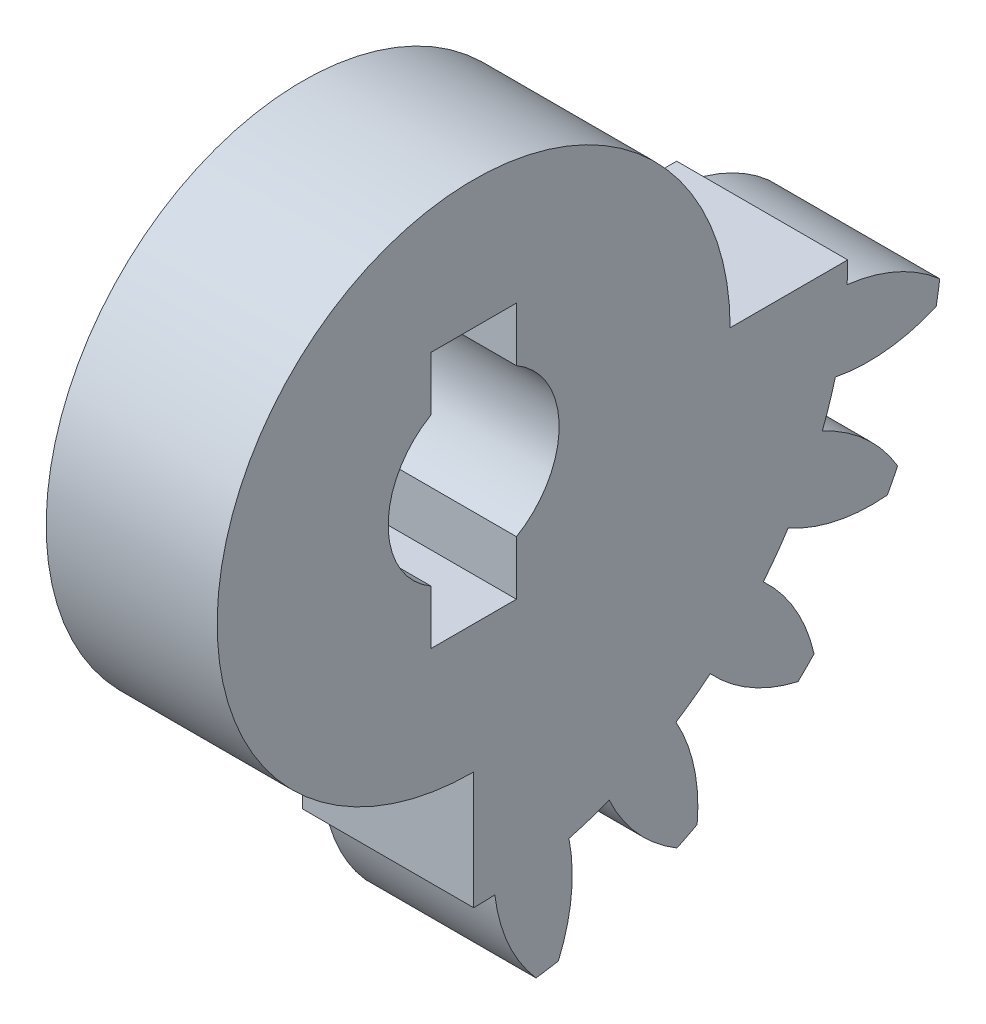
ISO-10303-21;
HEADER;
FILE_DESCRIPTION(('STEP AP214'),'2;1');
FILE_NAME('part.step','',(''),(''),'','','');
FILE_SCHEMA(('AUTOMOTIVE_DESIGN { 1 0 10303 214 1 1 1 1 }'));
ENDSEC;
DATA;
#1=APPLICATION_CONTEXT('core data for automotive mechanical design processes');
#2=APPLICATION_PROTOCOL_DEFINITION('international standard','automotive_design',2000,#1);
#3=PRODUCT_CONTEXT('',#1,'mechanical');
#4=PRODUCT('Part','Part','',(#3));
#5=PRODUCT_RELATED_PRODUCT_CATEGORY('part','',(#4));
#6=PRODUCT_DEFINITION_FORMATION('','',#4);
#7=PRODUCT_DEFINITION_CONTEXT('part definition',#1,'design');
#8=PRODUCT_DEFINITION('design','',#6,#7);
#9=PRODUCT_DEFINITION_SHAPE('','',#8);
#10=(LENGTH_UNIT() NAMED_UNIT(*) SI_UNIT(.MILLI.,.METRE.));
#11=(NAMED_UNIT(*) PLANE_ANGLE_UNIT() SI_UNIT($,.RADIAN.));
#12=(NAMED_UNIT(*) SI_UNIT($,.STERADIAN.) SOLID_ANGLE_UNIT());
#13=UNCERTAINTY_MEASURE_WITH_UNIT(LENGTH_MEASURE(1.E-05),#10,'distance_accuracy_value','');
#14=(GEOMETRIC_REPRESENTATION_CONTEXT(3) GLOBAL_UNCERTAINTY_ASSIGNED_CONTEXT((#13)) GLOBAL_UNIT_ASSIGNED_CONTEXT((#10,
#11,#12)) REPRESENTATION_CONTEXT('',''));
#15=CARTESIAN_POINT('',(0.,0.,0.));
#16=DIRECTION('',(0.,0.,1.));
#17=DIRECTION('',(1.,0.,0.));
#18=AXIS2_PLACEMENT_3D('',#15,#16,#17);
#19=CARTESIAN_POINT('',(3.,0.,0.));
#20=DIRECTION('',(-1.,0.,0.));
#21=DIRECTION('',(0.,0.,1.));
#22=AXIS2_PLACEMENT_3D('',#19,#20,#21);
#23=PLANE('',#22);
#24=DIRECTION('',(0.,1.,0.));
#25=VECTOR('',#24,1.);
#26=CARTESIAN_POINT('',(3.,-7.5,2.5));
#27=LINE('',#26,#25);
#28=CARTESIAN_POINT('',(3.,4.33012701892219,2.5));
#29=VERTEX_POINT('',#28);
#30=CARTESIAN_POINT('',(3.,7.5,2.5));
#31=VERTEX_POINT('',#30);
#32=EDGE_CURVE('E589',#29,#31,#27,.T.);
#33=ORIENTED_EDGE('',*,*,#32,.F.);
#34=CARTESIAN_POINT('',(3.,0.,0.));
#35=DIRECTION('',(-1.,0.,0.));
#36=DIRECTION('',(0.,0.,1.));
#37=AXIS2_PLACEMENT_3D('',#34,#35,#36);
#38=CIRCLE('',#37,5.);
#39=CARTESIAN_POINT('',(3.,4.33012701892219,-2.5));
#40=VERTEX_POINT('',#39);
#41=EDGE_CURVE('E11',#29,#40,#38,.T.);
#42=ORIENTED_EDGE('',*,*,#41,.T.);
#43=DIRECTION('',(0.,-1.,0.));
#44=VECTOR('',#43,1.);
#45=CARTESIAN_POINT('',(3.,-7.5,-2.5));
#46=LINE('',#45,#44);
#47=CARTESIAN_POINT('',(3.,7.5,-2.5));
#48=VERTEX_POINT('',#47);
#49=EDGE_CURVE('E271',#48,#40,#46,.T.);
#50=ORIENTED_EDGE('',*,*,#49,.F.);
#51=DIRECTION('',(0.,0.,-1.));
#52=VECTOR('',#51,1.);
#53=CARTESIAN_POINT('',(3.,7.5,2.5));
#54=LINE('',#53,#52);
#55=EDGE_CURVE('E272',#31,#48,#54,.T.);
#56=ORIENTED_EDGE('',*,*,#55,.F.);
#57=EDGE_LOOP('',(#33,#42,#50,#56));
#58=FACE_BOUND('',#57,.T.);
#59=ADVANCED_FACE('F39',(#58),#23,.F.);
#60=CARTESIAN_POINT('',(22.,-7.5,-2.5));
#61=DIRECTION('',(0.,0.,-1.));
#62=DIRECTION('',(-1.,0.,0.));
#63=AXIS2_PLACEMENT_3D('',#60,#61,#62);
#64=PLANE('',#63);
#65=ORIENTED_EDGE('',*,*,#49,.T.);
#66=DIRECTION('',(1.,0.,0.));
#67=VECTOR('',#66,1.);
#68=CARTESIAN_POINT('',(-10.,4.33012701892219,-2.5));
#69=LINE('',#68,#67);
#70=CARTESIAN_POINT('',(12.,4.33012701892219,-2.5));
#71=VERTEX_POINT('',#70);
#72=EDGE_CURVE('E280',#71,#40,#69,.F.);
#73=ORIENTED_EDGE('',*,*,#72,.F.);
#74=DIRECTION('',(0.,-1.,0.));
#75=VECTOR('',#74,1.);
#76=CARTESIAN_POINT('',(12.,0.,-2.5));
#77=LINE('',#76,#75);
#78=CARTESIAN_POINT('',(12.,7.5,-2.5));
#79=VERTEX_POINT('',#78);
#80=EDGE_CURVE('E285',#79,#71,#77,.T.);
#81=ORIENTED_EDGE('',*,*,#80,.F.);
#82=DIRECTION('',(-1.,0.,0.));
#83=VECTOR('',#82,1.);
#84=CARTESIAN_POINT('',(22.,7.5,-2.5));
#85=LINE('',#84,#83);
#86=EDGE_CURVE('E298',#79,#48,#85,.T.);
#87=ORIENTED_EDGE('',*,*,#86,.T.);
#88=EDGE_LOOP('',(#65,#73,#81,#87));
#89=FACE_BOUND('',#88,.T.);
#90=ADVANCED_FACE('F681',(#89),#64,.F.);
#91=CARTESIAN_POINT('',(22.,-7.5,2.5));
#92=DIRECTION('',(0.,0.,1.));
#93=DIRECTION('',(1.,0.,0.));
#94=AXIS2_PLACEMENT_3D('',#91,#92,#93);
#95=PLANE('',#94);
#96=ORIENTED_EDGE('',*,*,#32,.T.);
#97=DIRECTION('',(-1.,0.,0.));
#98=VECTOR('',#97,1.);
#99=CARTESIAN_POINT('',(22.,7.5,2.5));
#100=LINE('',#99,#98);
#101=CARTESIAN_POINT('',(12.,7.5,2.5));
#102=VERTEX_POINT('',#101);
#103=EDGE_CURVE('E443',#102,#31,#100,.T.);
#104=ORIENTED_EDGE('',*,*,#103,.F.);
#105=DIRECTION('',(0.,1.,0.));
#106=VECTOR('',#105,1.);
#107=CARTESIAN_POINT('',(12.,0.,2.5));
#108=LINE('',#107,#106);
#109=CARTESIAN_POINT('',(12.,4.33012701892219,2.5));
#110=VERTEX_POINT('',#109);
#111=EDGE_CURVE('E434',#110,#102,#108,.T.);
#112=ORIENTED_EDGE('',*,*,#111,.F.);
#113=DIRECTION('',(1.,0.,0.));
#114=VECTOR('',#113,1.);
#115=CARTESIAN_POINT('',(-10.,4.33012701892219,2.5));
#116=LINE('',#115,#114);
#117=EDGE_CURVE('E294',#29,#110,#116,.T.);
#118=ORIENTED_EDGE('',*,*,#117,.F.);
#119=EDGE_LOOP('',(#96,#104,#112,#118));
#120=FACE_BOUND('',#119,.T.);
#121=ADVANCED_FACE('F597',(#120),#95,.F.);
#122=CARTESIAN_POINT('',(22.,7.5,2.5));
#123=DIRECTION('',(0.,1.,0.));
#124=DIRECTION('',(0.,0.,1.));
#125=AXIS2_PLACEMENT_3D('',#122,#123,#124);
#126=PLANE('',#125);
#127=ORIENTED_EDGE('',*,*,#55,.T.);
#128=ORIENTED_EDGE('',*,*,#86,.F.);
#129=DIRECTION('',(0.,0.,-1.));
#130=VECTOR('',#129,1.);
#131=CARTESIAN_POINT('',(12.,7.5,0.));
#132=LINE('',#131,#130);
#133=EDGE_CURVE('E279',#102,#79,#132,.T.);
#134=ORIENTED_EDGE('',*,*,#133,.F.);
#135=ORIENTED_EDGE('',*,*,#103,.T.);
#136=EDGE_LOOP('',(#127,#128,#134,#135));
#137=FACE_BOUND('',#136,.T.);
#138=ADVANCED_FACE('F601',(#137),#126,.F.);
#139=CARTESIAN_POINT('',(22.,-7.5,2.5));
#140=DIRECTION('',(0.,-1.,0.));
#141=DIRECTION('',(0.,0.,-1.));
#142=AXIS2_PLACEMENT_3D('',#139,#140,#141);
#143=PLANE('',#142);
#144=DIRECTION('',(0.,0.,1.));
#145=VECTOR('',#144,1.);
#146=CARTESIAN_POINT('',(3.,-7.5,2.5));
#147=LINE('',#146,#145);
#148=CARTESIAN_POINT('',(3.,-7.5,-2.5));
#149=VERTEX_POINT('',#148);
#150=CARTESIAN_POINT('',(3.,-7.5,2.5));
#151=VERTEX_POINT('',#150);
#152=EDGE_CURVE('E266',#149,#151,#147,.T.);
#153=ORIENTED_EDGE('',*,*,#152,.T.);
#154=DIRECTION('',(-1.,0.,0.));
#155=VECTOR('',#154,1.);
#156=CARTESIAN_POINT('',(22.,-7.5,2.5));
#157=LINE('',#156,#155);
#158=CARTESIAN_POINT('',(12.,-7.5,2.5));
#159=VERTEX_POINT('',#158);
#160=EDGE_CURVE('E442',#159,#151,#157,.T.);
#161=ORIENTED_EDGE('',*,*,#160,.F.);
#162=DIRECTION('',(0.,0.,1.));
#163=VECTOR('',#162,1.);
#164=CARTESIAN_POINT('',(12.,-7.5,0.));
#165=LINE('',#164,#163);
#166=CARTESIAN_POINT('',(12.,-7.5,-2.5));
#167=VERTEX_POINT('',#166);
#168=EDGE_CURVE('E427',#167,#159,#165,.T.);
#169=ORIENTED_EDGE('',*,*,#168,.F.);
#170=DIRECTION('',(-1.,0.,0.));
#171=VECTOR('',#170,1.);
#172=CARTESIAN_POINT('',(22.,-7.5,-2.5));
#173=LINE('',#172,#171);
#174=EDGE_CURVE('E439',#167,#149,#173,.T.);
#175=ORIENTED_EDGE('',*,*,#174,.T.);
#176=EDGE_LOOP('',(#153,#161,#169,#175));
#177=FACE_BOUND('',#176,.T.);
#178=ADVANCED_FACE('F707',(#177),#143,.F.);
#179=CARTESIAN_POINT('',(3.,-4.33012701892219,-2.5));
#180=VERTEX_POINT('',#179);
#181=EDGE_CURVE('E263',#180,#149,#46,.T.);
#182=ORIENTED_EDGE('',*,*,#181,.T.);
#183=ORIENTED_EDGE('',*,*,#174,.F.);
#184=CARTESIAN_POINT('',(12.,-4.33012701892219,-2.5));
#185=VERTEX_POINT('',#184);
#186=EDGE_CURVE('E276',#185,#167,#77,.T.);
#187=ORIENTED_EDGE('',*,*,#186,.F.);
#188=DIRECTION('',(1.,0.,0.));
#189=VECTOR('',#188,1.);
#190=CARTESIAN_POINT('',(-10.,-4.33012701892219,-2.5));
#191=LINE('',#190,#189);
#192=EDGE_CURVE('E254',#180,#185,#191,.T.);
#193=ORIENTED_EDGE('',*,*,#192,.F.);
#194=EDGE_LOOP('',(#182,#183,#187,#193));
#195=FACE_BOUND('',#194,.T.);
#196=ADVANCED_FACE('F274',(#195),#64,.F.);
#197=CARTESIAN_POINT('',(3.,-4.33012701892219,2.5));
#198=VERTEX_POINT('',#197);
#199=EDGE_CURVE('E587',#151,#198,#27,.T.);
#200=ORIENTED_EDGE('',*,*,#199,.T.);
#201=DIRECTION('',(1.,0.,0.));
#202=VECTOR('',#201,1.);
#203=CARTESIAN_POINT('',(-10.,-4.33012701892219,2.5));
#204=LINE('',#203,#202);
#205=CARTESIAN_POINT('',(12.,-4.33012701892219,2.5));
#206=VERTEX_POINT('',#205);
#207=EDGE_CURVE('E257',#206,#198,#204,.F.);
#208=ORIENTED_EDGE('',*,*,#207,.F.);
#209=EDGE_CURVE('E431',#159,#206,#108,.T.);
#210=ORIENTED_EDGE('',*,*,#209,.F.);
#211=ORIENTED_EDGE('',*,*,#160,.T.);
#212=EDGE_LOOP('',(#200,#208,#210,#211));
#213=FACE_BOUND('',#212,.T.);
#214=ADVANCED_FACE('F713',(#213),#95,.F.);
#215=CARTESIAN_POINT('',(-10.,0.,0.));
#216=DIRECTION('',(-1.,0.,0.));
#217=DIRECTION('',(0.,0.,1.));
#218=AXIS2_PLACEMENT_3D('',#215,#216,#217);
#219=CYLINDRICAL_SURFACE('',#218,27.5);
#220=CARTESIAN_POINT('',(2.,0.,0.));
#221=DIRECTION('',(-1.,0.,0.));
#222=DIRECTION('',(0.,0.,1.));
#223=AXIS2_PLACEMENT_3D('',#220,#221,#222);
#224=CIRCLE('',#223,27.5);
#225=CARTESIAN_POINT('',(2.,-27.0500416130065,-4.95431617224976));
#226=VERTEX_POINT('',#225);
#227=CARTESIAN_POINT('',(2.,-27.2570862348367,-3.64708787756433));
#228=VERTEX_POINT('',#227);
#229=EDGE_CURVE('E560',#226,#228,#224,.T.);
#230=ORIENTED_EDGE('',*,*,#229,.F.);
#231=DIRECTION('',(-1.,0.,0.));
#232=VECTOR('',#231,1.);
#233=CARTESIAN_POINT('',(6.,-27.0500416130065,-4.95431617224976));
#234=LINE('',#233,#232);
#235=CARTESIAN_POINT('',(12.,-27.0500416130065,-4.95431617224976));
#236=VERTEX_POINT('',#235);
#237=EDGE_CURVE('E324',#236,#226,#234,.T.);
#238=ORIENTED_EDGE('',*,*,#237,.F.);
#239=CARTESIAN_POINT('',(12.,0.,0.));
#240=DIRECTION('',(-1.,0.,0.));
#241=DIRECTION('',(0.,0.,1.));
#242=AXIS2_PLACEMENT_3D('',#239,#240,#241);
#243=CIRCLE('',#242,27.5);
#244=CARTESIAN_POINT('',(12.,-27.2570862348367,-3.64708787756433));
#245=VERTEX_POINT('',#244);
#246=EDGE_CURVE('E456',#236,#245,#243,.T.);
#247=ORIENTED_EDGE('',*,*,#246,.T.);
#248=DIRECTION('',(-1.,0.,0.));
#249=VECTOR('',#248,1.);
#250=CARTESIAN_POINT('',(6.,-27.2570862348367,-3.64708787756434));
#251=LINE('',#250,#249);
#252=EDGE_CURVE('E299',#228,#245,#251,.F.);
#253=ORIENTED_EDGE('',*,*,#252,.F.);
#254=EDGE_LOOP('',(#230,#238,#247,#253));
#255=FACE_BOUND('',#254,.T.);
#256=ADVANCED_FACE('F659',(#255),#219,.T.);
#257=CARTESIAN_POINT('',(2.,0.,0.));
#258=DIRECTION('',(-1.,0.,0.));
#259=DIRECTION('',(0.,0.,1.));
#260=AXIS2_PLACEMENT_3D('',#257,#258,#259);
#261=CIRCLE('',#260,27.5);
#262=CARTESIAN_POINT('',(2.,-18.9718693822293,-19.9077415128797));
#263=VERTEX_POINT('',#262);
#264=CARTESIAN_POINT('',(2.,-19.9077415128793,-18.9718693822296));
#265=VERTEX_POINT('',#264);
#266=EDGE_CURVE('E503',#263,#265,#261,.T.);
#267=ORIENTED_EDGE('',*,*,#266,.F.);
#268=DIRECTION('',(-1.,0.,0.));
#269=VECTOR('',#268,1.);
#270=CARTESIAN_POINT('',(6.,-18.9718693822293,-19.9077415128797));
#271=LINE('',#270,#269);
#272=CARTESIAN_POINT('',(12.,-18.9718693822293,-19.9077415128797));
#273=VERTEX_POINT('',#272);
#274=EDGE_CURVE('E304',#273,#263,#271,.T.);
#275=ORIENTED_EDGE('',*,*,#274,.F.);
#276=CARTESIAN_POINT('',(12.,-19.9077415128793,-18.9718693822296));
#277=VERTEX_POINT('',#276);
#278=EDGE_CURVE('E466',#273,#277,#243,.T.);
#279=ORIENTED_EDGE('',*,*,#278,.T.);
#280=DIRECTION('',(-1.,0.,0.));
#281=VECTOR('',#280,1.);
#282=CARTESIAN_POINT('',(6.,-19.9077415128793,-18.9718693822296));
#283=LINE('',#282,#281);
#284=EDGE_CURVE('E340',#265,#277,#283,.F.);
#285=ORIENTED_EDGE('',*,*,#284,.F.);
#286=EDGE_LOOP('',(#267,#275,#279,#285));
#287=FACE_BOUND('',#286,.T.);
#288=ADVANCED_FACE('F624',(#287),#219,.T.);
#289=CARTESIAN_POINT('',(2.,0.,0.));
#290=DIRECTION('',(-1.,0.,0.));
#291=DIRECTION('',(0.,0.,1.));
#292=AXIS2_PLACEMENT_3D('',#289,#290,#291);
#293=CIRCLE('',#292,27.5);
#294=CARTESIAN_POINT('',(2.,-11.8914895551662,-24.7960173447143));
#295=VERTEX_POINT('',#294);
#296=CARTESIAN_POINT('',(2.,-13.0707572363727,-24.1951504493733));
#297=VERTEX_POINT('',#296);
#298=EDGE_CURVE('E530',#295,#297,#293,.T.);
#299=ORIENTED_EDGE('',*,*,#298,.F.);
#300=DIRECTION('',(-1.,0.,0.));
#301=VECTOR('',#300,1.);
#302=CARTESIAN_POINT('',(6.,-11.8914895551662,-24.7960173447143));
#303=LINE('',#302,#301);
#304=CARTESIAN_POINT('',(12.,-11.8914895551662,-24.7960173447143));
#305=VERTEX_POINT('',#304);
#306=EDGE_CURVE('E314',#305,#295,#303,.T.);
#307=ORIENTED_EDGE('',*,*,#306,.F.);
#308=CARTESIAN_POINT('',(12.,-13.0707572363727,-24.1951504493733));
#309=VERTEX_POINT('',#308);
#310=EDGE_CURVE('E613',#305,#309,#243,.T.);
#311=ORIENTED_EDGE('',*,*,#310,.T.);
#312=DIRECTION('',(-1.,0.,0.));
#313=VECTOR('',#312,1.);
#314=CARTESIAN_POINT('',(6.,-13.0707572363727,-24.1951504493733));
#315=LINE('',#314,#313);
#316=EDGE_CURVE('E310',#297,#309,#315,.F.);
#317=ORIENTED_EDGE('',*,*,#316,.F.);
#318=EDGE_LOOP('',(#299,#307,#311,#317));
#319=FACE_BOUND('',#318,.T.);
#320=ADVANCED_FACE('F719',(#319),#219,.T.);
#321=CARTESIAN_POINT('',(2.,0.,0.));
#322=DIRECTION('',(-1.,0.,0.));
#323=DIRECTION('',(0.,0.,1.));
#324=AXIS2_PLACEMENT_3D('',#321,#322,#323);
#325=CIRCLE('',#324,27.5);
#326=CARTESIAN_POINT('',(2.,-3.64708787756386,-27.2570862348368));
#327=VERTEX_POINT('',#326);
#328=CARTESIAN_POINT('',(2.,-4.95431617224929,-27.0500416130066));
#329=VERTEX_POINT('',#328);
#330=EDGE_CURVE('E563',#327,#329,#325,.T.);
#331=ORIENTED_EDGE('',*,*,#330,.F.);
#332=DIRECTION('',(-1.,0.,0.));
#333=VECTOR('',#332,1.);
#334=CARTESIAN_POINT('',(6.,-3.64708787756386,-27.2570862348368));
#335=LINE('',#334,#333);
#336=CARTESIAN_POINT('',(12.,-3.64708787756386,-27.2570862348368));
#337=VERTEX_POINT('',#336);
#338=EDGE_CURVE('E344',#337,#327,#335,.T.);
#339=ORIENTED_EDGE('',*,*,#338,.F.);
#340=CARTESIAN_POINT('',(12.,-4.95431617224929,-27.0500416130066));
#341=VERTEX_POINT('',#340);
#342=EDGE_CURVE('E467',#337,#341,#243,.T.);
#343=ORIENTED_EDGE('',*,*,#342,.T.);
#344=DIRECTION('',(-1.,0.,0.));
#345=VECTOR('',#344,1.);
#346=CARTESIAN_POINT('',(6.,-4.95431617224929,-27.0500416130066));
#347=LINE('',#346,#345);
#348=EDGE_CURVE('E320',#329,#341,#347,.F.);
#349=ORIENTED_EDGE('',*,*,#348,.F.);
#350=EDGE_LOOP('',(#331,#339,#343,#349));
#351=FACE_BOUND('',#350,.T.);
#352=ADVANCED_FACE('F723',(#351),#219,.T.);
#353=CARTESIAN_POINT('',(2.,0.,0.));
#354=DIRECTION('',(-1.,0.,0.));
#355=DIRECTION('',(0.,0.,1.));
#356=AXIS2_PLACEMENT_3D('',#353,#354,#355);
#357=CIRCLE('',#356,27.5);
#358=CARTESIAN_POINT('',(2.,-24.1951504493731,-13.0707572363732));
#359=VERTEX_POINT('',#358);
#360=CARTESIAN_POINT('',(2.,-24.7960173447141,-11.8914895551666));
#361=VERTEX_POINT('',#360);
#362=EDGE_CURVE('E533',#359,#361,#357,.T.);
#363=ORIENTED_EDGE('',*,*,#362,.F.);
#364=DIRECTION('',(-1.,0.,0.));
#365=VECTOR('',#364,1.);
#366=CARTESIAN_POINT('',(6.,-24.1951504493731,-13.0707572363732));
#367=LINE('',#366,#365);
#368=CARTESIAN_POINT('',(12.,-24.1951504493731,-13.0707572363732));
#369=VERTEX_POINT('',#368);
#370=EDGE_CURVE('E334',#369,#359,#367,.T.);
#371=ORIENTED_EDGE('',*,*,#370,.F.);
#372=CARTESIAN_POINT('',(12.,-24.7960173447141,-11.8914895551666));
#373=VERTEX_POINT('',#372);
#374=EDGE_CURVE('E349',#369,#373,#243,.T.);
#375=ORIENTED_EDGE('',*,*,#374,.T.);
#376=DIRECTION('',(-1.,0.,0.));
#377=VECTOR('',#376,1.);
#378=CARTESIAN_POINT('',(6.,-24.7960173447141,-11.8914895551666));
#379=LINE('',#378,#377);
#380=EDGE_CURVE('E330',#361,#373,#379,.F.);
#381=ORIENTED_EDGE('',*,*,#380,.F.);
#382=EDGE_LOOP('',(#363,#371,#375,#381));
#383=FACE_BOUND('',#382,.T.);
#384=ADVANCED_FACE('F642',(#383),#219,.T.);
#385=CARTESIAN_POINT('',(12.,-11.1688719594236,-20.6674910859766));
#386=DIRECTION('',(-1.,0.,0.));
#387=DIRECTION('',(0.,0.,1.));
#388=AXIS2_PLACEMENT_3D('',#385,#386,#387);
#389=CYLINDRICAL_SURFACE('',#388,10.);
#390=ORIENTED_EDGE('',*,*,#338,.T.);
#391=CARTESIAN_POINT('',(2.,-11.1688719594236,-20.6674910859766));
#392=DIRECTION('',(-1.,0.,0.));
#393=DIRECTION('',(0.,0.,1.));
#394=AXIS2_PLACEMENT_3D('',#391,#392,#393);
#395=CIRCLE('',#394,10.);
#396=CARTESIAN_POINT('',(2.,-1.23772526720537,-21.8389540079858));
#397=VERTEX_POINT('',#396);
#398=EDGE_CURVE('E484',#327,#397,#395,.F.);
#399=ORIENTED_EDGE('',*,*,#398,.T.);
#400=DIRECTION('',(-1.,0.,0.));
#401=VECTOR('',#400,1.);
#402=CARTESIAN_POINT('',(12.,-1.23772526720537,-21.8389540079858));
#403=LINE('',#402,#401);
#404=CARTESIAN_POINT('',(12.,-1.23772526720537,-21.8389540079858));
#405=VERTEX_POINT('',#404);
#406=EDGE_CURVE('E339',#405,#397,#403,.T.);
#407=ORIENTED_EDGE('',*,*,#406,.F.);
#408=CARTESIAN_POINT('',(12.,-11.1688719594236,-20.6674910859766));
#409=DIRECTION('',(-1.,0.,0.));
#410=DIRECTION('',(0.,-1.,0.));
#411=AXIS2_PLACEMENT_3D('',#408,#409,#410);
#412=CIRCLE('',#411,10.);
#413=EDGE_CURVE('E348',#405,#337,#412,.T.);
#414=ORIENTED_EDGE('',*,*,#413,.T.);
#415=EDGE_LOOP('',(#390,#399,#407,#414));
#416=FACE_BOUND('',#415,.T.);
#417=ADVANCED_FACE('F722',(#416),#389,.T.);
#418=CARTESIAN_POINT('',(12.,0.,0.));
#419=DIRECTION('',(-1.,0.,0.));
#420=DIRECTION('',(0.,0.,1.));
#421=AXIS2_PLACEMENT_3D('',#418,#419,#420);
#422=CYLINDRICAL_SURFACE('',#421,21.874);
#423=ORIENTED_EDGE('',*,*,#406,.T.);
#424=CARTESIAN_POINT('',(2.,0.,0.));
#425=DIRECTION('',(-1.,0.,0.));
#426=DIRECTION('',(0.,0.,1.));
#427=AXIS2_PLACEMENT_3D('',#424,#425,#426);
#428=CIRCLE('',#427,21.874);
#429=CARTESIAN_POINT('',(2.,0.,-21.874));
#430=VERTEX_POINT('',#429);
#431=EDGE_CURVE('E473',#397,#430,#428,.F.);
#432=ORIENTED_EDGE('',*,*,#431,.T.);
#433=DIRECTION('',(-1.,0.,0.));
#434=VECTOR('',#433,1.);
#435=CARTESIAN_POINT('',(12.,0.,-21.874));
#436=LINE('',#435,#434);
#437=CARTESIAN_POINT('',(12.,0.,-21.874));
#438=VERTEX_POINT('',#437);
#439=EDGE_CURVE('E460',#438,#430,#436,.T.);
#440=ORIENTED_EDGE('',*,*,#439,.F.);
#441=CARTESIAN_POINT('',(12.,0.,0.));
#442=DIRECTION('',(-1.,0.,0.));
#443=DIRECTION('',(0.,-1.,0.));
#444=AXIS2_PLACEMENT_3D('',#441,#442,#443);
#445=CIRCLE('',#444,21.874);
#446=EDGE_CURVE('E353',#438,#405,#445,.T.);
#447=ORIENTED_EDGE('',*,*,#446,.T.);
#448=EDGE_LOOP('',(#423,#432,#440,#447));
#449=FACE_BOUND('',#448,.T.);
#450=ADVANCED_FACE('F480',(#449),#422,.T.);
#451=CARTESIAN_POINT('',(12.,-23.28524974214,-3.11223923905164));
#452=DIRECTION('',(-1.,0.,0.));
#453=DIRECTION('',(0.,0.,1.));
#454=AXIS2_PLACEMENT_3D('',#451,#452,#453);
#455=CYLINDRICAL_SURFACE('',#454,10.);
#456=ORIENTED_EDGE('',*,*,#370,.T.);
#457=CARTESIAN_POINT('',(2.,-23.28524974214,-3.11223923905164));
#458=DIRECTION('',(-1.,0.,0.));
#459=DIRECTION('',(0.,0.,1.));
#460=AXIS2_PLACEMENT_3D('',#457,#458,#459);
#461=CIRCLE('',#460,10.);
#462=CARTESIAN_POINT('',(2.,-18.3956015902865,-11.8352743158512));
#463=VERTEX_POINT('',#462);
#464=EDGE_CURVE('E522',#359,#463,#461,.F.);
#465=ORIENTED_EDGE('',*,*,#464,.T.);
#466=DIRECTION('',(-1.,0.,0.));
#467=VECTOR('',#466,1.);
#468=CARTESIAN_POINT('',(12.,-18.3956015902865,-11.8352743158512));
#469=LINE('',#468,#467);
#470=CARTESIAN_POINT('',(12.,-18.3956015902865,-11.8352743158512));
#471=VERTEX_POINT('',#470);
#472=EDGE_CURVE('E329',#471,#463,#469,.T.);
#473=ORIENTED_EDGE('',*,*,#472,.F.);
#474=CARTESIAN_POINT('',(12.,-23.28524974214,-3.11223923905164));
#475=DIRECTION('',(-1.,0.,0.));
#476=DIRECTION('',(0.,-0.58778525229248,0.809016994374942));
#477=AXIS2_PLACEMENT_3D('',#474,#475,#476);
#478=CIRCLE('',#477,10.);
#479=EDGE_CURVE('E338',#471,#369,#478,.T.);
#480=ORIENTED_EDGE('',*,*,#479,.T.);
#481=EDGE_LOOP('',(#456,#465,#473,#480));
#482=FACE_BOUND('',#481,.T.);
#483=ADVANCED_FACE('F638',(#482),#455,.T.);
#484=CARTESIAN_POINT('',(12.,-10.1554532971553,-21.1838536853949));
#485=DIRECTION('',(-1.,0.,0.));
#486=DIRECTION('',(0.,0.,1.));
#487=AXIS2_PLACEMENT_3D('',#484,#485,#486);
#488=CYLINDRICAL_SURFACE('',#487,10.);
#489=DIRECTION('',(-1.,0.,0.));
#490=VECTOR('',#489,1.);
#491=CARTESIAN_POINT('',(12.,-16.9405682733801,-13.8379558669244));
#492=LINE('',#491,#490);
#493=CARTESIAN_POINT('',(12.,-16.9405682733801,-13.8379558669244));
#494=VERTEX_POINT('',#493);
#495=CARTESIAN_POINT('',(2.,-16.9405682733801,-13.8379558669244));
#496=VERTEX_POINT('',#495);
#497=EDGE_CURVE('E372',#494,#496,#492,.T.);
#498=ORIENTED_EDGE('',*,*,#497,.T.);
#499=CARTESIAN_POINT('',(2.,-10.1554532971553,-21.1838536853949));
#500=DIRECTION('',(-1.,0.,0.));
#501=DIRECTION('',(0.,0.,1.));
#502=AXIS2_PLACEMENT_3D('',#499,#500,#501);
#503=CIRCLE('',#502,10.);
#504=EDGE_CURVE('E506',#496,#265,#503,.F.);
#505=ORIENTED_EDGE('',*,*,#504,.T.);
#506=ORIENTED_EDGE('',*,*,#284,.T.);
#507=CARTESIAN_POINT('',(12.,-10.1554532971553,-21.1838536853949));
#508=DIRECTION('',(-1.,0.,0.));
#509=DIRECTION('',(0.,-0.58778525229248,0.809016994374942));
#510=AXIS2_PLACEMENT_3D('',#507,#508,#509);
#511=CIRCLE('',#510,10.);
#512=EDGE_CURVE('E343',#277,#494,#511,.T.);
#513=ORIENTED_EDGE('',*,*,#512,.T.);
#514=EDGE_LOOP('',(#498,#505,#506,#513));
#515=FACE_BOUND('',#514,.T.);
#516=ADVANCED_FACE('F632',(#515),#488,.T.);
#517=CARTESIAN_POINT('',(12.,0.,0.));
#518=DIRECTION('',(-1.,0.,0.));
#519=DIRECTION('',(0.,0.,1.));
#520=AXIS2_PLACEMENT_3D('',#517,#518,#519);
#521=CYLINDRICAL_SURFACE('',#520,21.874);
#522=ORIENTED_EDGE('',*,*,#472,.T.);
#523=CARTESIAN_POINT('',(2.,0.,0.));
#524=DIRECTION('',(-1.,0.,0.));
#525=DIRECTION('',(0.,0.,1.));
#526=AXIS2_PLACEMENT_3D('',#523,#524,#525);
#527=CIRCLE('',#526,21.874);
#528=EDGE_CURVE('E510',#463,#496,#527,.F.);
#529=ORIENTED_EDGE('',*,*,#528,.T.);
#530=ORIENTED_EDGE('',*,*,#497,.F.);
#531=CARTESIAN_POINT('',(12.,0.,0.));
#532=DIRECTION('',(-1.,0.,0.));
#533=DIRECTION('',(0.,-0.58778525229248,0.809016994374942));
#534=AXIS2_PLACEMENT_3D('',#531,#532,#533);
#535=CIRCLE('',#534,21.874);
#536=EDGE_CURVE('E376',#494,#471,#535,.T.);
#537=ORIENTED_EDGE('',*,*,#536,.T.);
#538=EDGE_LOOP('',(#522,#529,#530,#537));
#539=FACE_BOUND('',#538,.T.);
#540=ADVANCED_FACE('F634',(#539),#521,.T.);
#541=CARTESIAN_POINT('',(12.,-23.1073233162498,4.23562248001661));
#542=DIRECTION('',(-1.,0.,0.));
#543=DIRECTION('',(0.,0.,1.));
#544=AXIS2_PLACEMENT_3D('',#541,#542,#543);
#545=CYLINDRICAL_SURFACE('',#544,10.);
#546=ORIENTED_EDGE('',*,*,#237,.T.);
#547=CARTESIAN_POINT('',(2.,-23.1073233162498,4.23562248001661));
#548=DIRECTION('',(-1.,0.,0.));
#549=DIRECTION('',(0.,0.,1.));
#550=AXIS2_PLACEMENT_3D('',#547,#548,#549);
#551=CIRCLE('',#550,10.);
#552=CARTESIAN_POINT('',(2.,-21.1525576602989,-5.57146124708161));
#553=VERTEX_POINT('',#552);
#554=EDGE_CURVE('E552',#226,#553,#551,.F.);
#555=ORIENTED_EDGE('',*,*,#554,.T.);
#556=DIRECTION('',(-1.,0.,0.));
#557=VECTOR('',#556,1.);
#558=CARTESIAN_POINT('',(12.,-21.1525576602989,-5.57146124708161));
#559=LINE('',#558,#557);
#560=CARTESIAN_POINT('',(12.,-21.1525576602989,-5.57146124708161));
#561=VERTEX_POINT('',#560);
#562=EDGE_CURVE('E319',#561,#553,#559,.T.);
#563=ORIENTED_EDGE('',*,*,#562,.F.);
#564=CARTESIAN_POINT('',(12.,-23.1073233162498,4.23562248001661));
#565=DIRECTION('',(-1.,0.,0.));
#566=DIRECTION('',(0.,-0.309016994374955,0.951056516295151));
#567=AXIS2_PLACEMENT_3D('',#564,#565,#566);
#568=CIRCLE('',#567,10.);
#569=EDGE_CURVE('E328',#561,#236,#568,.T.);
#570=ORIENTED_EDGE('',*,*,#569,.T.);
#571=EDGE_LOOP('',(#546,#555,#563,#570));
#572=FACE_BOUND('',#571,.T.);
#573=ADVANCED_FACE('F655',(#572),#545,.T.);
#574=CARTESIAN_POINT('',(12.,-16.20458082933,-17.0088344333359));
#575=DIRECTION('',(-1.,0.,0.));
#576=DIRECTION('',(0.,0.,1.));
#577=AXIS2_PLACEMENT_3D('',#574,#575,#576);
#578=CYLINDRICAL_SURFACE('',#577,10.);
#579=DIRECTION('',(-1.,0.,0.));
#580=VECTOR('',#579,1.);
#581=CARTESIAN_POINT('',(12.,-20.3876013764312,-7.9257546085997));
#582=LINE('',#581,#580);
#583=CARTESIAN_POINT('',(12.,-20.3876013764312,-7.9257546085997));
#584=VERTEX_POINT('',#583);
#585=CARTESIAN_POINT('',(2.,-20.3876013764312,-7.9257546085997));
#586=VERTEX_POINT('',#585);
#587=EDGE_CURVE('E358',#584,#586,#582,.T.);
#588=ORIENTED_EDGE('',*,*,#587,.T.);
#589=CARTESIAN_POINT('',(2.,-16.20458082933,-17.0088344333359));
#590=DIRECTION('',(-1.,0.,0.));
#591=DIRECTION('',(0.,0.,1.));
#592=AXIS2_PLACEMENT_3D('',#589,#590,#591);
#593=CIRCLE('',#592,10.);
#594=EDGE_CURVE('E536',#586,#361,#593,.F.);
#595=ORIENTED_EDGE('',*,*,#594,.T.);
#596=ORIENTED_EDGE('',*,*,#380,.T.);
#597=CARTESIAN_POINT('',(12.,-16.20458082933,-17.0088344333359));
#598=DIRECTION('',(-1.,0.,0.));
#599=DIRECTION('',(0.,-0.309016994374955,0.951056516295151));
#600=AXIS2_PLACEMENT_3D('',#597,#598,#599);
#601=CIRCLE('',#600,10.);
#602=EDGE_CURVE('E333',#373,#584,#601,.T.);
#603=ORIENTED_EDGE('',*,*,#602,.T.);
#604=EDGE_LOOP('',(#588,#595,#596,#603));
#605=FACE_BOUND('',#604,.T.);
#606=ADVANCED_FACE('F649',(#605),#578,.T.);
#607=CARTESIAN_POINT('',(12.,0.,0.));
#608=DIRECTION('',(-1.,0.,0.));
#609=DIRECTION('',(0.,0.,1.));
#610=AXIS2_PLACEMENT_3D('',#607,#608,#609);
#611=CYLINDRICAL_SURFACE('',#610,21.874);
#612=ORIENTED_EDGE('',*,*,#562,.T.);
#613=CARTESIAN_POINT('',(2.,0.,0.));
#614=DIRECTION('',(-1.,0.,0.));
#615=DIRECTION('',(0.,0.,1.));
#616=AXIS2_PLACEMENT_3D('',#613,#614,#615);
#617=CIRCLE('',#616,21.874);
#618=EDGE_CURVE('E540',#553,#586,#617,.F.);
#619=ORIENTED_EDGE('',*,*,#618,.T.);
#620=ORIENTED_EDGE('',*,*,#587,.F.);
#621=CARTESIAN_POINT('',(12.,0.,0.));
#622=DIRECTION('',(-1.,0.,0.));
#623=DIRECTION('',(0.,-0.309016994374955,0.951056516295151));
#624=AXIS2_PLACEMENT_3D('',#621,#622,#623);
#625=CIRCLE('',#624,21.874);
#626=EDGE_CURVE('E362',#584,#561,#625,.T.);
#627=ORIENTED_EDGE('',*,*,#626,.T.);
#628=EDGE_LOOP('',(#612,#619,#620,#627));
#629=FACE_BOUND('',#628,.T.);
#630=ADVANCED_FACE('F651',(#629),#611,.T.);
#631=CARTESIAN_POINT('',(12.,-17.0088344333356,-16.2045808293303));
#632=DIRECTION('',(-1.,0.,0.));
#633=DIRECTION('',(0.,0.,1.));
#634=AXIS2_PLACEMENT_3D('',#631,#632,#633);
#635=CYLINDRICAL_SURFACE('',#634,10.);
#636=ORIENTED_EDGE('',*,*,#306,.T.);
#637=CARTESIAN_POINT('',(2.,-17.0088344333356,-16.2045808293303));
#638=DIRECTION('',(-1.,0.,0.));
#639=DIRECTION('',(0.,0.,1.));
#640=AXIS2_PLACEMENT_3D('',#637,#638,#639);
#641=CIRCLE('',#640,10.);
#642=CARTESIAN_POINT('',(2.,-7.92575460859934,-20.3876013764314));
#643=VERTEX_POINT('',#642);
#644=EDGE_CURVE('E544',#295,#643,#641,.F.);
#645=ORIENTED_EDGE('',*,*,#644,.T.);
#646=DIRECTION('',(-1.,0.,0.));
#647=VECTOR('',#646,1.);
#648=CARTESIAN_POINT('',(12.,-7.92575460859934,-20.3876013764314));
#649=LINE('',#648,#647);
#650=CARTESIAN_POINT('',(12.,-7.92575460859934,-20.3876013764314));
#651=VERTEX_POINT('',#650);
#652=EDGE_CURVE('E309',#651,#643,#649,.T.);
#653=ORIENTED_EDGE('',*,*,#652,.F.);
#654=CARTESIAN_POINT('',(12.,-17.0088344333356,-16.2045808293303));
#655=DIRECTION('',(-1.,0.,0.));
#656=DIRECTION('',(0.,-0.951056516295157,0.309016994374938));
#657=AXIS2_PLACEMENT_3D('',#654,#655,#656);
#658=CIRCLE('',#657,10.);
#659=EDGE_CURVE('E318',#651,#305,#658,.T.);
#660=ORIENTED_EDGE('',*,*,#659,.T.);
#661=EDGE_LOOP('',(#636,#645,#653,#660));
#662=FACE_BOUND('',#661,.T.);
#663=ADVANCED_FACE('F750',(#662),#635,.T.);
#664=CARTESIAN_POINT('',(12.,4.23562248001701,-23.1073233162497));
#665=DIRECTION('',(-1.,0.,0.));
#666=DIRECTION('',(0.,0.,1.));
#667=AXIS2_PLACEMENT_3D('',#664,#665,#666);
#668=CYLINDRICAL_SURFACE('',#667,10.);
#669=DIRECTION('',(-1.,0.,0.));
#670=VECTOR('',#669,1.);
#671=CARTESIAN_POINT('',(12.,-5.57146124708125,-21.1525576602989));
#672=LINE('',#671,#670);
#673=CARTESIAN_POINT('',(12.,-5.57146124708125,-21.1525576602989));
#674=VERTEX_POINT('',#673);
#675=CARTESIAN_POINT('',(2.,-5.57146124708125,-21.1525576602989));
#676=VERTEX_POINT('',#675);
#677=EDGE_CURVE('E400',#674,#676,#672,.T.);
#678=ORIENTED_EDGE('',*,*,#677,.T.);
#679=CARTESIAN_POINT('',(2.,4.23562248001701,-23.1073233162497));
#680=DIRECTION('',(-1.,0.,0.));
#681=DIRECTION('',(0.,0.,1.));
#682=AXIS2_PLACEMENT_3D('',#679,#680,#681);
#683=CIRCLE('',#682,10.);
#684=EDGE_CURVE('E556',#676,#329,#683,.F.);
#685=ORIENTED_EDGE('',*,*,#684,.T.);
#686=ORIENTED_EDGE('',*,*,#348,.T.);
#687=CARTESIAN_POINT('',(12.,4.23562248001701,-23.1073233162497));
#688=DIRECTION('',(-1.,0.,0.));
#689=DIRECTION('',(0.,-0.951056516295157,0.309016994374938));
#690=AXIS2_PLACEMENT_3D('',#687,#688,#689);
#691=CIRCLE('',#690,10.);
#692=EDGE_CURVE('E323',#341,#674,#691,.T.);
#693=ORIENTED_EDGE('',*,*,#692,.T.);
#694=EDGE_LOOP('',(#678,#685,#686,#693));
#695=FACE_BOUND('',#694,.T.);
#696=ADVANCED_FACE('F744',(#695),#668,.T.);
#697=CARTESIAN_POINT('',(12.,0.,0.));
#698=DIRECTION('',(-1.,0.,0.));
#699=DIRECTION('',(0.,0.,1.));
#700=AXIS2_PLACEMENT_3D('',#697,#698,#699);
#701=CYLINDRICAL_SURFACE('',#700,21.874);
#702=ORIENTED_EDGE('',*,*,#652,.T.);
#703=CARTESIAN_POINT('',(2.,0.,0.));
#704=DIRECTION('',(-1.,0.,0.));
#705=DIRECTION('',(0.,0.,1.));
#706=AXIS2_PLACEMENT_3D('',#703,#704,#705);
#707=CIRCLE('',#706,21.874);
#708=EDGE_CURVE('E548',#643,#676,#707,.F.);
#709=ORIENTED_EDGE('',*,*,#708,.T.);
#710=ORIENTED_EDGE('',*,*,#677,.F.);
#711=CARTESIAN_POINT('',(12.,0.,0.));
#712=DIRECTION('',(-1.,0.,0.));
#713=DIRECTION('',(0.,-0.951056516295157,0.309016994374938));
#714=AXIS2_PLACEMENT_3D('',#711,#712,#713);
#715=CIRCLE('',#714,21.874);
#716=EDGE_CURVE('E404',#674,#651,#715,.T.);
#717=ORIENTED_EDGE('',*,*,#716,.T.);
#718=EDGE_LOOP('',(#702,#709,#710,#717));
#719=FACE_BOUND('',#718,.T.);
#720=ADVANCED_FACE('F746',(#719),#701,.T.);
#721=CARTESIAN_POINT('',(12.,-21.1838536853947,-10.1554532971557));
#722=DIRECTION('',(-1.,0.,0.));
#723=DIRECTION('',(0.,0.,1.));
#724=AXIS2_PLACEMENT_3D('',#721,#722,#723);
#725=CYLINDRICAL_SURFACE('',#724,10.);
#726=ORIENTED_EDGE('',*,*,#274,.T.);
#727=CARTESIAN_POINT('',(2.,-21.1838536853947,-10.1554532971557));
#728=DIRECTION('',(-1.,0.,0.));
#729=DIRECTION('',(0.,0.,1.));
#730=AXIS2_PLACEMENT_3D('',#727,#728,#729);
#731=CIRCLE('',#730,10.);
#732=CARTESIAN_POINT('',(2.,-13.8379558669241,-16.9405682733803));
#733=VERTEX_POINT('',#732);
#734=EDGE_CURVE('E514',#263,#733,#731,.F.);
#735=ORIENTED_EDGE('',*,*,#734,.T.);
#736=DIRECTION('',(-1.,0.,0.));
#737=VECTOR('',#736,1.);
#738=CARTESIAN_POINT('',(12.,-13.8379558669241,-16.9405682733803));
#739=LINE('',#738,#737);
#740=CARTESIAN_POINT('',(12.,-13.8379558669241,-16.9405682733803));
#741=VERTEX_POINT('',#740);
#742=EDGE_CURVE('E303',#741,#733,#739,.T.);
#743=ORIENTED_EDGE('',*,*,#742,.F.);
#744=CARTESIAN_POINT('',(12.,-21.1838536853947,-10.1554532971557));
#745=DIRECTION('',(-1.,0.,0.));
#746=DIRECTION('',(0.,-0.809016994374953,0.587785252292465));
#747=AXIS2_PLACEMENT_3D('',#744,#745,#746);
#748=CIRCLE('',#747,10.);
#749=EDGE_CURVE('E308',#741,#273,#748,.T.);
#750=ORIENTED_EDGE('',*,*,#749,.T.);
#751=EDGE_LOOP('',(#726,#735,#743,#750));
#752=FACE_BOUND('',#751,.T.);
#753=ADVANCED_FACE('F762',(#752),#725,.T.);
#754=CARTESIAN_POINT('',(12.,-3.11223923905121,-23.28524974214));
#755=DIRECTION('',(-1.,0.,0.));
#756=DIRECTION('',(0.,0.,1.));
#757=AXIS2_PLACEMENT_3D('',#754,#755,#756);
#758=CYLINDRICAL_SURFACE('',#757,10.);
#759=DIRECTION('',(-1.,0.,0.));
#760=VECTOR('',#759,1.);
#761=CARTESIAN_POINT('',(12.,-11.8352743158509,-18.3956015902867));
#762=LINE('',#761,#760);
#763=CARTESIAN_POINT('',(12.,-11.8352743158509,-18.3956015902867));
#764=VERTEX_POINT('',#763);
#765=CARTESIAN_POINT('',(2.,-11.8352743158509,-18.3956015902867));
#766=VERTEX_POINT('',#765);
#767=EDGE_CURVE('E386',#764,#766,#762,.T.);
#768=ORIENTED_EDGE('',*,*,#767,.T.);
#769=CARTESIAN_POINT('',(2.,-3.11223923905121,-23.28524974214));
#770=DIRECTION('',(-1.,0.,0.));
#771=DIRECTION('',(0.,0.,1.));
#772=AXIS2_PLACEMENT_3D('',#769,#770,#771);
#773=CIRCLE('',#772,10.);
#774=EDGE_CURVE('E526',#766,#297,#773,.F.);
#775=ORIENTED_EDGE('',*,*,#774,.T.);
#776=ORIENTED_EDGE('',*,*,#316,.T.);
#777=CARTESIAN_POINT('',(12.,-3.11223923905121,-23.28524974214));
#778=DIRECTION('',(-1.,0.,0.));
#779=DIRECTION('',(0.,-0.809016994374953,0.587785252292465));
#780=AXIS2_PLACEMENT_3D('',#777,#778,#779);
#781=CIRCLE('',#780,10.);
#782=EDGE_CURVE('E313',#309,#764,#781,.T.);
#783=ORIENTED_EDGE('',*,*,#782,.T.);
#784=EDGE_LOOP('',(#768,#775,#776,#783));
#785=FACE_BOUND('',#784,.T.);
#786=ADVANCED_FACE('F757',(#785),#758,.T.);
#787=CARTESIAN_POINT('',(12.,0.,0.));
#788=DIRECTION('',(-1.,0.,0.));
#789=DIRECTION('',(0.,0.,1.));
#790=AXIS2_PLACEMENT_3D('',#787,#788,#789);
#791=CYLINDRICAL_SURFACE('',#790,21.874);
#792=ORIENTED_EDGE('',*,*,#742,.T.);
#793=CARTESIAN_POINT('',(2.,0.,0.));
#794=DIRECTION('',(-1.,0.,0.));
#795=DIRECTION('',(0.,0.,1.));
#796=AXIS2_PLACEMENT_3D('',#793,#794,#795);
#797=CIRCLE('',#796,21.874);
#798=EDGE_CURVE('E518',#733,#766,#797,.F.);
#799=ORIENTED_EDGE('',*,*,#798,.T.);
#800=ORIENTED_EDGE('',*,*,#767,.F.);
#801=CARTESIAN_POINT('',(12.,0.,0.));
#802=DIRECTION('',(-1.,0.,0.));
#803=DIRECTION('',(0.,-0.809016994374953,0.587785252292465));
#804=AXIS2_PLACEMENT_3D('',#801,#802,#803);
#805=CIRCLE('',#804,21.874);
#806=EDGE_CURVE('E390',#764,#741,#805,.T.);
#807=ORIENTED_EDGE('',*,*,#806,.T.);
#808=EDGE_LOOP('',(#792,#799,#800,#807));
#809=FACE_BOUND('',#808,.T.);
#810=ADVANCED_FACE('F759',(#809),#791,.T.);
#811=CARTESIAN_POINT('',(12.,-20.6674910859764,-11.168871959424));
#812=DIRECTION('',(-1.,0.,0.));
#813=DIRECTION('',(0.,0.,1.));
#814=AXIS2_PLACEMENT_3D('',#811,#812,#813);
#815=CYLINDRICAL_SURFACE('',#814,10.);
#816=DIRECTION('',(-1.,0.,0.));
#817=VECTOR('',#816,1.);
#818=CARTESIAN_POINT('',(12.,-21.8389540079858,-1.23772526720575));
#819=LINE('',#818,#817);
#820=CARTESIAN_POINT('',(12.,-21.8389540079858,-1.23772526720575));
#821=VERTEX_POINT('',#820);
#822=CARTESIAN_POINT('',(2.,-21.8389540079858,-1.23772526720575));
#823=VERTEX_POINT('',#822);
#824=EDGE_CURVE('E414',#821,#823,#819,.T.);
#825=ORIENTED_EDGE('',*,*,#824,.T.);
#826=CARTESIAN_POINT('',(2.,-20.6674910859764,-11.168871959424));
#827=DIRECTION('',(-1.,0.,0.));
#828=DIRECTION('',(0.,0.,1.));
#829=AXIS2_PLACEMENT_3D('',#826,#827,#828);
#830=CIRCLE('',#829,10.);
#831=EDGE_CURVE('E485',#823,#228,#830,.F.);
#832=ORIENTED_EDGE('',*,*,#831,.T.);
#833=ORIENTED_EDGE('',*,*,#252,.T.);
#834=CARTESIAN_POINT('',(12.,-20.6674910859764,-11.168871959424));
#835=DIRECTION('',(-1.,0.,0.));
#836=DIRECTION('',(0.,0.,1.));
#837=AXIS2_PLACEMENT_3D('',#834,#835,#836);
#838=CIRCLE('',#837,10.);
#839=EDGE_CURVE('E302',#245,#821,#838,.T.);
#840=ORIENTED_EDGE('',*,*,#839,.T.);
#841=EDGE_LOOP('',(#825,#832,#833,#840));
#842=FACE_BOUND('',#841,.T.);
#843=ADVANCED_FACE('F665',(#842),#815,.T.);
#844=CARTESIAN_POINT('',(12.,0.,0.));
#845=DIRECTION('',(-1.,0.,0.));
#846=DIRECTION('',(0.,0.,1.));
#847=AXIS2_PLACEMENT_3D('',#844,#845,#846);
#848=CYLINDRICAL_SURFACE('',#847,21.874);
#849=DIRECTION('',(-1.,0.,0.));
#850=VECTOR('',#849,1.);
#851=CARTESIAN_POINT('',(22.,-21.874,0.));
#852=LINE('',#851,#850);
#853=CARTESIAN_POINT('',(12.,-21.874,0.));
#854=VERTEX_POINT('',#853);
#855=CARTESIAN_POINT('',(2.,-21.874,0.));
#856=VERTEX_POINT('',#855);
#857=EDGE_CURVE('E63',#854,#856,#852,.T.);
#858=ORIENTED_EDGE('',*,*,#857,.T.);
#859=CARTESIAN_POINT('',(2.,0.,0.));
#860=DIRECTION('',(-1.,0.,0.));
#861=DIRECTION('',(0.,0.,1.));
#862=AXIS2_PLACEMENT_3D('',#859,#860,#861);
#863=CIRCLE('',#862,21.874);
#864=EDGE_CURVE('E571',#856,#823,#863,.F.);
#865=ORIENTED_EDGE('',*,*,#864,.T.);
#866=ORIENTED_EDGE('',*,*,#824,.F.);
#867=CARTESIAN_POINT('',(12.,0.,0.));
#868=DIRECTION('',(-1.,0.,0.));
#869=DIRECTION('',(0.,0.,1.));
#870=AXIS2_PLACEMENT_3D('',#867,#868,#869);
#871=CIRCLE('',#870,21.874);
#872=EDGE_CURVE('E418',#821,#854,#871,.T.);
#873=ORIENTED_EDGE('',*,*,#872,.T.);
#874=EDGE_LOOP('',(#858,#865,#866,#873));
#875=FACE_BOUND('',#874,.T.);
#876=ADVANCED_FACE('F667',(#875),#848,.T.);
#877=CARTESIAN_POINT('',(-10.,0.,0.));
#878=DIRECTION('',(1.,0.,0.));
#879=DIRECTION('',(0.,0.,-1.));
#880=AXIS2_PLACEMENT_3D('',#877,#878,#879);
#881=CYLINDRICAL_SURFACE('',#880,5.);
#882=ORIENTED_EDGE('',*,*,#41,.F.);
#883=ORIENTED_EDGE('',*,*,#117,.T.);
#884=CARTESIAN_POINT('',(12.,0.,0.));
#885=DIRECTION('',(1.,0.,0.));
#886=DIRECTION('',(0.,0.,-1.));
#887=AXIS2_PLACEMENT_3D('',#884,#885,#886);
#888=CIRCLE('',#887,5.);
#889=EDGE_CURVE('E295',#110,#206,#888,.T.);
#890=ORIENTED_EDGE('',*,*,#889,.T.);
#891=ORIENTED_EDGE('',*,*,#207,.T.);
#892=EDGE_CURVE('E43',#180,#198,#38,.T.);
#893=ORIENTED_EDGE('',*,*,#892,.F.);
#894=ORIENTED_EDGE('',*,*,#192,.T.);
#895=EDGE_CURVE('E288',#185,#71,#888,.T.);
#896=ORIENTED_EDGE('',*,*,#895,.T.);
#897=ORIENTED_EDGE('',*,*,#72,.T.);
#898=EDGE_LOOP('',(#882,#883,#890,#891,#893,#894,#896,#897));
#899=FACE_BOUND('',#898,.T.);
#900=CARTESIAN_POINT('',(2.,0.,0.));
#901=DIRECTION('',(-1.,0.,0.));
#902=DIRECTION('',(0.,0.,1.));
#903=AXIS2_PLACEMENT_3D('',#900,#901,#902);
#904=CIRCLE('',#903,5.);
#905=CARTESIAN_POINT('',(2.,0.,5.));
#906=VERTEX_POINT('',#905);
#907=EDGE_CURVE('E497',#906,#906,#904,.F.);
#908=ORIENTED_EDGE('',*,*,#907,.F.);
#909=EDGE_LOOP('',(#908));
#910=FACE_BOUND('',#909,.T.);
#911=ADVANCED_FACE('F250',(#899,#910),#881,.F.);
#912=CARTESIAN_POINT('',(22.,0.,0.));
#913=DIRECTION('',(0.,0.,-1.));
#914=DIRECTION('',(0.,1.,0.));
#915=AXIS2_PLACEMENT_3D('',#912,#913,#914);
#916=PLANE('',#915);
#917=DIRECTION('',(0.,1.,0.));
#918=VECTOR('',#917,1.);
#919=CARTESIAN_POINT('',(2.,0.,0.));
#920=LINE('',#919,#918);
#921=CARTESIAN_POINT('',(2.,-15.,0.));
#922=VERTEX_POINT('',#921);
#923=EDGE_CURVE('E575',#856,#922,#920,.T.);
#924=ORIENTED_EDGE('',*,*,#923,.F.);
#925=ORIENTED_EDGE('',*,*,#857,.F.);
#926=DIRECTION('',(0.,-1.,0.));
#927=VECTOR('',#926,1.);
#928=CARTESIAN_POINT('',(12.,0.,0.));
#929=LINE('',#928,#927);
#930=CARTESIAN_POINT('',(12.,-15.,0.));
#931=VERTEX_POINT('',#930);
#932=EDGE_CURVE('E438',#931,#854,#929,.T.);
#933=ORIENTED_EDGE('',*,*,#932,.F.);
#934=DIRECTION('',(-1.,0.,0.));
#935=VECTOR('',#934,1.);
#936=CARTESIAN_POINT('',(22.,-15.,0.));
#937=LINE('',#936,#935);
#938=EDGE_CURVE('E447',#931,#922,#937,.T.);
#939=ORIENTED_EDGE('',*,*,#938,.T.);
#940=EDGE_LOOP('',(#924,#925,#933,#939));
#941=FACE_BOUND('',#940,.T.);
#942=ADVANCED_FACE('F668',(#941),#916,.F.);
#943=CARTESIAN_POINT('',(257.,0.,0.));
#944=DIRECTION('',(-1.,0.,0.));
#945=DIRECTION('',(0.,0.,1.));
#946=AXIS2_PLACEMENT_3D('',#943,#944,#945);
#947=CYLINDRICAL_SURFACE('',#946,15.);
#948=CARTESIAN_POINT('',(2.,0.,0.));
#949=DIRECTION('',(-1.,0.,0.));
#950=DIRECTION('',(0.,0.,1.));
#951=AXIS2_PLACEMENT_3D('',#948,#949,#950);
#952=CIRCLE('',#951,15.);
#953=CARTESIAN_POINT('',(2.,0.,-15.));
#954=VERTEX_POINT('',#953);
#955=EDGE_CURVE('E55',#922,#954,#952,.T.);
#956=ORIENTED_EDGE('',*,*,#955,.F.);
#957=ORIENTED_EDGE('',*,*,#938,.F.);
#958=CARTESIAN_POINT('',(12.,0.,0.));
#959=DIRECTION('',(-1.,0.,0.));
#960=DIRECTION('',(0.,0.,1.));
#961=AXIS2_PLACEMENT_3D('',#958,#959,#960);
#962=CIRCLE('',#961,15.);
#963=CARTESIAN_POINT('',(12.,0.,-15.));
#964=VERTEX_POINT('',#963);
#965=EDGE_CURVE('E425',#964,#931,#962,.F.);
#966=ORIENTED_EDGE('',*,*,#965,.F.);
#967=DIRECTION('',(-1.,0.,0.));
#968=VECTOR('',#967,1.);
#969=CARTESIAN_POINT('',(257.,0.,-15.));
#970=LINE('',#969,#968);
#971=EDGE_CURVE('E490',#964,#954,#970,.T.);
#972=ORIENTED_EDGE('',*,*,#971,.T.);
#973=EDGE_LOOP('',(#956,#957,#966,#972));
#974=FACE_BOUND('',#973,.T.);
#975=ADVANCED_FACE('F670',(#974),#947,.T.);
#976=CARTESIAN_POINT('',(257.,0.,-15.));
#977=DIRECTION('',(0.,-1.,0.));
#978=DIRECTION('',(0.,0.,-1.));
#979=AXIS2_PLACEMENT_3D('',#976,#977,#978);
#980=PLANE('',#979);
#981=DIRECTION('',(0.,0.,-1.));
#982=VECTOR('',#981,1.);
#983=CARTESIAN_POINT('',(2.,0.,-15.));
#984=LINE('',#983,#982);
#985=EDGE_CURVE('E261',#954,#430,#984,.T.);
#986=ORIENTED_EDGE('',*,*,#985,.F.);
#987=ORIENTED_EDGE('',*,*,#971,.F.);
#988=DIRECTION('',(0.,0.,1.));
#989=VECTOR('',#988,1.);
#990=CARTESIAN_POINT('',(12.,0.,0.));
#991=LINE('',#990,#989);
#992=EDGE_CURVE('E489',#438,#964,#991,.T.);
#993=ORIENTED_EDGE('',*,*,#992,.F.);
#994=ORIENTED_EDGE('',*,*,#439,.T.);
#995=EDGE_LOOP('',(#986,#987,#993,#994));
#996=FACE_BOUND('',#995,.T.);
#997=ADVANCED_FACE('F487',(#996),#980,.F.);
#998=CARTESIAN_POINT('',(12.,0.,0.));
#999=DIRECTION('',(-1.,0.,0.));
#1000=DIRECTION('',(0.,0.,1.));
#1001=AXIS2_PLACEMENT_3D('',#998,#999,#1000);
#1002=PLANE('',#1001);
#1003=ORIENTED_EDGE('',*,*,#133,.T.);
#1004=ORIENTED_EDGE('',*,*,#80,.T.);
#1005=ORIENTED_EDGE('',*,*,#895,.F.);
#1006=ORIENTED_EDGE('',*,*,#186,.T.);
#1007=ORIENTED_EDGE('',*,*,#168,.T.);
#1008=ORIENTED_EDGE('',*,*,#209,.T.);
#1009=ORIENTED_EDGE('',*,*,#889,.F.);
#1010=ORIENTED_EDGE('',*,*,#111,.T.);
#1011=EDGE_LOOP('',(#1003,#1004,#1005,#1006,#1007,#1008,#1009,#1010));
#1012=FACE_BOUND('',#1011,.T.);
#1013=ORIENTED_EDGE('',*,*,#992,.T.);
#1014=ORIENTED_EDGE('',*,*,#965,.T.);
#1015=ORIENTED_EDGE('',*,*,#932,.T.);
#1016=ORIENTED_EDGE('',*,*,#872,.F.);
#1017=ORIENTED_EDGE('',*,*,#839,.F.);
#1018=ORIENTED_EDGE('',*,*,#246,.F.);
#1019=ORIENTED_EDGE('',*,*,#569,.F.);
#1020=ORIENTED_EDGE('',*,*,#626,.F.);
#1021=ORIENTED_EDGE('',*,*,#602,.F.);
#1022=ORIENTED_EDGE('',*,*,#374,.F.);
#1023=ORIENTED_EDGE('',*,*,#479,.F.);
#1024=ORIENTED_EDGE('',*,*,#536,.F.);
#1025=ORIENTED_EDGE('',*,*,#512,.F.);
#1026=ORIENTED_EDGE('',*,*,#278,.F.);
#1027=ORIENTED_EDGE('',*,*,#749,.F.);
#1028=ORIENTED_EDGE('',*,*,#806,.F.);
#1029=ORIENTED_EDGE('',*,*,#782,.F.);
#1030=ORIENTED_EDGE('',*,*,#310,.F.);
#1031=ORIENTED_EDGE('',*,*,#659,.F.);
#1032=ORIENTED_EDGE('',*,*,#716,.F.);
#1033=ORIENTED_EDGE('',*,*,#692,.F.);
#1034=ORIENTED_EDGE('',*,*,#342,.F.);
#1035=ORIENTED_EDGE('',*,*,#413,.F.);
#1036=ORIENTED_EDGE('',*,*,#446,.F.);
#1037=EDGE_LOOP('',(#1013,#1014,#1015,#1016,#1017,#1018,#1019,#1020,#1021,#1022,#1023,#1024,
#1025,#1026,#1027,#1028,#1029,#1030,#1031,#1032,#1033,#1034,#1035,#1036));
#1038=FACE_BOUND('',#1037,.T.);
#1039=ADVANCED_FACE('F41',(#1012,#1038),#1002,.F.);
#1040=CARTESIAN_POINT('',(2.,0.,0.));
#1041=DIRECTION('',(-1.,0.,0.));
#1042=DIRECTION('',(0.,0.,1.));
#1043=AXIS2_PLACEMENT_3D('',#1040,#1041,#1042);
#1044=PLANE('',#1043);
#1045=ORIENTED_EDGE('',*,*,#907,.T.);
#1046=EDGE_LOOP('',(#1045));
#1047=FACE_BOUND('',#1046,.T.);
#1048=ORIENTED_EDGE('',*,*,#266,.T.);
#1049=ORIENTED_EDGE('',*,*,#504,.F.);
#1050=ORIENTED_EDGE('',*,*,#528,.F.);
#1051=ORIENTED_EDGE('',*,*,#464,.F.);
#1052=ORIENTED_EDGE('',*,*,#362,.T.);
#1053=ORIENTED_EDGE('',*,*,#594,.F.);
#1054=ORIENTED_EDGE('',*,*,#618,.F.);
#1055=ORIENTED_EDGE('',*,*,#554,.F.);
#1056=ORIENTED_EDGE('',*,*,#229,.T.);
#1057=ORIENTED_EDGE('',*,*,#831,.F.);
#1058=ORIENTED_EDGE('',*,*,#864,.F.);
#1059=ORIENTED_EDGE('',*,*,#923,.T.);
#1060=ORIENTED_EDGE('',*,*,#955,.T.);
#1061=ORIENTED_EDGE('',*,*,#985,.T.);
#1062=ORIENTED_EDGE('',*,*,#431,.F.);
#1063=ORIENTED_EDGE('',*,*,#398,.F.);
#1064=ORIENTED_EDGE('',*,*,#330,.T.);
#1065=ORIENTED_EDGE('',*,*,#684,.F.);
#1066=ORIENTED_EDGE('',*,*,#708,.F.);
#1067=ORIENTED_EDGE('',*,*,#644,.F.);
#1068=ORIENTED_EDGE('',*,*,#298,.T.);
#1069=ORIENTED_EDGE('',*,*,#774,.F.);
#1070=ORIENTED_EDGE('',*,*,#798,.F.);
#1071=ORIENTED_EDGE('',*,*,#734,.F.);
#1072=EDGE_LOOP('',(#1048,#1049,#1050,#1051,#1052,#1053,#1054,#1055,#1056,#1057,#1058,#1059,
#1060,#1061,#1062,#1063,#1064,#1065,#1066,#1067,#1068,#1069,#1070,#1071));
#1073=FACE_BOUND('',#1072,.T.);
#1074=ADVANCED_FACE('F472',(#1047,#1073),#1044,.T.);
#1075=ORIENTED_EDGE('',*,*,#181,.F.);
#1076=ORIENTED_EDGE('',*,*,#892,.T.);
#1077=ORIENTED_EDGE('',*,*,#199,.F.);
#1078=ORIENTED_EDGE('',*,*,#152,.F.);
#1079=EDGE_LOOP('',(#1075,#1076,#1077,#1078));
#1080=FACE_BOUND('',#1079,.T.);
#1081=ADVANCED_FACE('F264',(#1080),#23,.F.);
#1082=CLOSED_SHELL('',(#59,#90,#121,#138,#178,#196,#214,#256,#288,#320,#352,#384,#417,#450,#483,
#516,#540,#573,#606,#630,#663,#696,#720,#753,#786,#810,#843,#876,#911,#942,#975,#997,#1039,
#1074,#1081));
#1083=MANIFOLD_SOLID_BREP('B2',#1082);
#1084=ADVANCED_BREP_SHAPE_REPRESENTATION('',(#18,#1083),#14);
#1085=SHAPE_DEFINITION_REPRESENTATION(#9,#1084);
ENDSEC;
END-ISO-10303-21;
